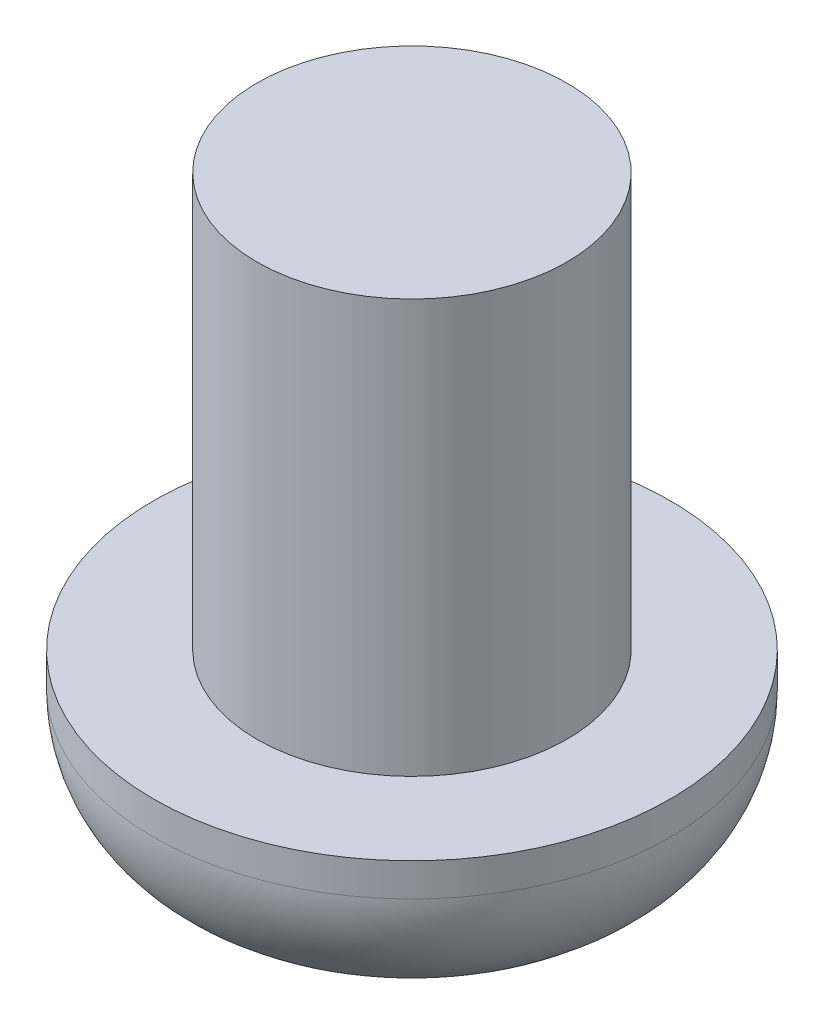
ISO-10303-21;
HEADER;
FILE_DESCRIPTION(('STEP AP214'),'2;1');
FILE_NAME('part.step','',(''),(''),'','','');
FILE_SCHEMA(('AUTOMOTIVE_DESIGN { 1 0 10303 214 1 1 1 1 }'));
ENDSEC;
DATA;
#1=APPLICATION_CONTEXT('core data for automotive mechanical design processes');
#2=APPLICATION_PROTOCOL_DEFINITION('international standard','automotive_design',2000,#1);
#3=PRODUCT_CONTEXT('',#1,'mechanical');
#4=PRODUCT('Part','Part','',(#3));
#5=PRODUCT_RELATED_PRODUCT_CATEGORY('part','',(#4));
#6=PRODUCT_DEFINITION_FORMATION('','',#4);
#7=PRODUCT_DEFINITION_CONTEXT('part definition',#1,'design');
#8=PRODUCT_DEFINITION('design','',#6,#7);
#9=PRODUCT_DEFINITION_SHAPE('','',#8);
#10=(LENGTH_UNIT() NAMED_UNIT(*) SI_UNIT(.MILLI.,.METRE.));
#11=(NAMED_UNIT(*) PLANE_ANGLE_UNIT() SI_UNIT($,.RADIAN.));
#12=(NAMED_UNIT(*) SI_UNIT($,.STERADIAN.) SOLID_ANGLE_UNIT());
#13=UNCERTAINTY_MEASURE_WITH_UNIT(LENGTH_MEASURE(1.E-05),#10,'distance_accuracy_value','');
#14=(GEOMETRIC_REPRESENTATION_CONTEXT(3) GLOBAL_UNCERTAINTY_ASSIGNED_CONTEXT((#13)) GLOBAL_UNIT_ASSIGNED_CONTEXT((#10,
#11,#12)) REPRESENTATION_CONTEXT('',''));
#15=CARTESIAN_POINT('',(0.,0.,0.));
#16=DIRECTION('',(0.,0.,1.));
#17=DIRECTION('',(1.,0.,0.));
#18=AXIS2_PLACEMENT_3D('',#15,#16,#17);
#19=CARTESIAN_POINT('',(0.,2.54,0.));
#20=DIRECTION('',(0.,1.,0.));
#21=DIRECTION('',(0.,0.,1.));
#22=AXIS2_PLACEMENT_3D('',#19,#20,#21);
#23=PLANE('',#22);
#24=CARTESIAN_POINT('',(0.,2.54,0.));
#25=DIRECTION('',(0.,1.,0.));
#26=DIRECTION('',(0.,0.,1.));
#27=AXIS2_PLACEMENT_3D('',#24,#25,#26);
#28=CIRCLE('',#27,3.96875);
#29=CARTESIAN_POINT('',(0.,2.54,3.96875));
#30=VERTEX_POINT('',#29);
#31=EDGE_CURVE('E45',#30,#30,#28,.T.);
#32=ORIENTED_EDGE('',*,*,#31,.T.);
#33=EDGE_LOOP('',(#32));
#34=FACE_BOUND('',#33,.T.);
#35=CARTESIAN_POINT('',(0.,2.54,0.));
#36=DIRECTION('',(0.,1.,0.));
#37=DIRECTION('',(0.,0.,1.));
#38=AXIS2_PLACEMENT_3D('',#35,#36,#37);
#39=CIRCLE('',#38,2.38125);
#40=CARTESIAN_POINT('',(0.,2.54,2.38125));
#41=VERTEX_POINT('',#40);
#42=EDGE_CURVE('E50',#41,#41,#39,.T.);
#43=ORIENTED_EDGE('',*,*,#42,.F.);
#44=EDGE_LOOP('',(#43));
#45=FACE_BOUND('',#44,.T.);
#46=ADVANCED_FACE('F30',(#34,#45),#23,.T.);
#47=CARTESIAN_POINT('',(0.,2.54,0.));
#48=DIRECTION('',(0.,-1.,0.));
#49=DIRECTION('',(0.,0.,-1.));
#50=AXIS2_PLACEMENT_3D('',#47,#48,#49);
#51=CYLINDRICAL_SURFACE('',#50,3.96875);
#52=CARTESIAN_POINT('',(0.,2.032,0.));
#53=DIRECTION('',(0.,1.,0.));
#54=DIRECTION('',(0.,0.,1.));
#55=AXIS2_PLACEMENT_3D('',#52,#53,#54);
#56=CIRCLE('',#55,3.96875);
#57=CARTESIAN_POINT('',(0.,2.032,3.96875));
#58=VERTEX_POINT('',#57);
#59=EDGE_CURVE('E41',#58,#58,#56,.T.);
#60=ORIENTED_EDGE('',*,*,#59,.T.);
#61=EDGE_LOOP('',(#60));
#62=FACE_BOUND('',#61,.T.);
#63=ORIENTED_EDGE('',*,*,#31,.F.);
#64=EDGE_LOOP('',(#63));
#65=FACE_BOUND('',#64,.T.);
#66=ADVANCED_FACE('F76',(#62,#65),#51,.T.);
#67=CARTESIAN_POINT('',(0.,0.,0.));
#68=DIRECTION('',(0.,1.,0.));
#69=DIRECTION('',(0.,0.,1.));
#70=AXIS2_PLACEMENT_3D('',#67,#68,#69);
#71=CYLINDRICAL_SURFACE('',#70,2.38125);
#72=ORIENTED_EDGE('',*,*,#42,.T.);
#73=EDGE_LOOP('',(#72));
#74=FACE_BOUND('',#73,.T.);
#75=CARTESIAN_POINT('',(0.,8.89,0.));
#76=DIRECTION('',(0.,1.,0.));
#77=DIRECTION('',(0.,0.,1.));
#78=AXIS2_PLACEMENT_3D('',#75,#76,#77);
#79=CIRCLE('',#78,2.38125);
#80=CARTESIAN_POINT('',(0.,8.89,2.38125));
#81=VERTEX_POINT('',#80);
#82=EDGE_CURVE('E53',#81,#81,#79,.T.);
#83=ORIENTED_EDGE('',*,*,#82,.F.);
#84=EDGE_LOOP('',(#83));
#85=FACE_BOUND('',#84,.T.);
#86=ADVANCED_FACE('F72',(#74,#85),#71,.T.);
#87=CARTESIAN_POINT('',(0.,8.89,0.));
#88=DIRECTION('',(0.,1.,0.));
#89=DIRECTION('',(0.,0.,1.));
#90=AXIS2_PLACEMENT_3D('',#87,#88,#89);
#91=PLANE('',#90);
#92=ORIENTED_EDGE('',*,*,#82,.T.);
#93=EDGE_LOOP('',(#92));
#94=FACE_BOUND('',#93,.T.);
#95=ADVANCED_FACE('F64',(#94),#91,.T.);
#96=CARTESIAN_POINT('',(0.,3.175,0.));
#97=DIRECTION('',(0.,-1.,0.));
#98=DIRECTION('',(0.,0.,-1.));
#99=AXIS2_PLACEMENT_3D('',#96,#97,#98);
#100=CYLINDRICAL_SURFACE('',#99,1.5875);
#101=CARTESIAN_POINT('',(0.,0.516290780690438,0.));
#102=DIRECTION('',(0.,1.,0.));
#103=DIRECTION('',(0.,0.,1.));
#104=AXIS2_PLACEMENT_3D('',#101,#102,#103);
#105=CIRCLE('',#104,1.5875);
#106=CARTESIAN_POINT('',(0.,0.516290780690438,1.5875));
#107=VERTEX_POINT('',#106);
#108=EDGE_CURVE('E37',#107,#107,#105,.F.);
#109=ORIENTED_EDGE('',*,*,#108,.T.);
#110=EDGE_LOOP('',(#109));
#111=FACE_BOUND('',#110,.T.);
#112=CARTESIAN_POINT('',(0.,3.175,0.));
#113=DIRECTION('',(0.,-1.,0.));
#114=DIRECTION('',(0.,0.,-1.));
#115=AXIS2_PLACEMENT_3D('',#112,#113,#114);
#116=CIRCLE('',#115,1.5875);
#117=CARTESIAN_POINT('',(0.,3.175,-1.5875));
#118=VERTEX_POINT('',#117);
#119=EDGE_CURVE('E56',#118,#118,#116,.T.);
#120=ORIENTED_EDGE('',*,*,#119,.F.);
#121=EDGE_LOOP('',(#120));
#122=FACE_BOUND('',#121,.T.);
#123=ADVANCED_FACE('F62',(#111,#122),#100,.F.);
#124=CARTESIAN_POINT('',(0.,3.175,0.));
#125=DIRECTION('',(0.,-1.,0.));
#126=DIRECTION('',(0.,0.,-1.));
#127=AXIS2_PLACEMENT_3D('',#124,#125,#126);
#128=PLANE('',#127);
#129=ORIENTED_EDGE('',*,*,#119,.T.);
#130=EDGE_LOOP('',(#129));
#131=FACE_BOUND('',#130,.T.);
#132=ADVANCED_FACE('F60',(#131),#128,.T.);
#133=CARTESIAN_POINT('',(0.,2.032,0.));
#134=DIRECTION('',(0.,1.,0.));
#135=DIRECTION('',(0.,0.,1.));
#136=AXIS2_PLACEMENT_3D('',#133,#134,#135);
#137=DEGENERATE_TOROIDAL_SURFACE('',#136,1.93675,2.032,.T.);
#138=CARTESIAN_POINT('',(0.,0.0110543742539264,0.));
#139=DIRECTION('',(0.,1.,0.));
#140=DIRECTION('',(0.,0.,1.));
#141=AXIS2_PLACEMENT_3D('',#138,#139,#140);
#142=CIRCLE('',#141,2.14841666666667);
#143=CARTESIAN_POINT('',(0.,0.0110543742539264,2.14841666666667));
#144=VERTEX_POINT('',#143);
#145=EDGE_CURVE('E10',#144,#144,#142,.T.);
#146=ORIENTED_EDGE('',*,*,#145,.T.);
#147=EDGE_LOOP('',(#146));
#148=FACE_BOUND('',#147,.T.);
#149=ORIENTED_EDGE('',*,*,#59,.F.);
#150=EDGE_LOOP('',(#149));
#151=FACE_BOUND('',#150,.T.);
#152=ADVANCED_FACE('F70',(#148,#151),#137,.T.);
#153=CARTESIAN_POINT('',(0.,0.516290780690438,0.));
#154=DIRECTION('',(0.,1.,0.));
#155=DIRECTION('',(0.,0.,1.));
#156=AXIS2_PLACEMENT_3D('',#153,#154,#155);
#157=TOROIDAL_SURFACE('',#156,2.0955,0.508);
#158=ORIENTED_EDGE('',*,*,#145,.F.);
#159=EDGE_LOOP('',(#158));
#160=FACE_BOUND('',#159,.T.);
#161=ORIENTED_EDGE('',*,*,#108,.F.);
#162=EDGE_LOOP('',(#161));
#163=FACE_BOUND('',#162,.T.);
#164=ADVANCED_FACE('F32',(#160,#163),#157,.T.);
#165=CLOSED_SHELL('',(#46,#66,#86,#95,#123,#132,#152,#164));
#166=MANIFOLD_SOLID_BREP('B2',#165);
#167=ADVANCED_BREP_SHAPE_REPRESENTATION('',(#18,#166),#14);
#168=SHAPE_DEFINITION_REPRESENTATION(#9,#167);
ENDSEC;
END-ISO-10303-21;
